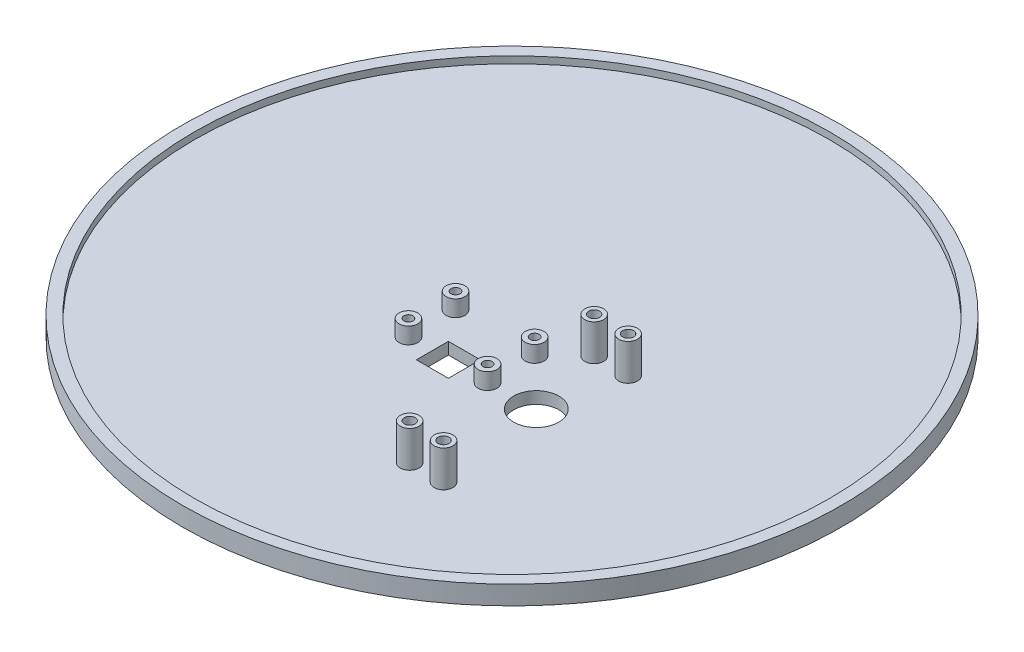
ISO-10303-21;
HEADER;
FILE_DESCRIPTION(('STEP AP214'),'2;1');
FILE_NAME('part.step','',(''),(''),'','','');
FILE_SCHEMA(('AUTOMOTIVE_DESIGN { 1 0 10303 214 1 1 1 1 }'));
ENDSEC;
DATA;
#1=APPLICATION_CONTEXT('core data for automotive mechanical design processes');
#2=APPLICATION_PROTOCOL_DEFINITION('international standard','automotive_design',2000,#1);
#3=PRODUCT_CONTEXT('',#1,'mechanical');
#4=PRODUCT('Part','Part','',(#3));
#5=PRODUCT_RELATED_PRODUCT_CATEGORY('part','',(#4));
#6=PRODUCT_DEFINITION_FORMATION('','',#4);
#7=PRODUCT_DEFINITION_CONTEXT('part definition',#1,'design');
#8=PRODUCT_DEFINITION('design','',#6,#7);
#9=PRODUCT_DEFINITION_SHAPE('','',#8);
#10=(LENGTH_UNIT() NAMED_UNIT(*) SI_UNIT(.MILLI.,.METRE.));
#11=(NAMED_UNIT(*) PLANE_ANGLE_UNIT() SI_UNIT($,.RADIAN.));
#12=(NAMED_UNIT(*) SI_UNIT($,.STERADIAN.) SOLID_ANGLE_UNIT());
#13=UNCERTAINTY_MEASURE_WITH_UNIT(LENGTH_MEASURE(1.E-05),#10,'distance_accuracy_value','');
#14=(GEOMETRIC_REPRESENTATION_CONTEXT(3) GLOBAL_UNCERTAINTY_ASSIGNED_CONTEXT((#13)) GLOBAL_UNIT_ASSIGNED_CONTEXT((#10,
#11,#12)) REPRESENTATION_CONTEXT('',''));
#15=CARTESIAN_POINT('',(0.,0.,0.));
#16=DIRECTION('',(0.,0.,1.));
#17=DIRECTION('',(1.,0.,0.));
#18=AXIS2_PLACEMENT_3D('',#15,#16,#17);
#19=CARTESIAN_POINT('',(18.5,12.8,-3.3254));
#20=DIRECTION('',(0.,1.,0.));
#21=DIRECTION('',(0.,0.,1.));
#22=AXIS2_PLACEMENT_3D('',#19,#20,#21);
#23=PLANE('',#22);
#24=CARTESIAN_POINT('',(18.5,12.8,-3.3254));
#25=DIRECTION('',(0.,1.,0.));
#26=DIRECTION('',(0.,0.,1.));
#27=AXIS2_PLACEMENT_3D('',#24,#25,#26);
#28=CIRCLE('',#27,2.5);
#29=CARTESIAN_POINT('',(18.5,12.8,-0.825399999999997));
#30=VERTEX_POINT('',#29);
#31=EDGE_CURVE('E212',#30,#30,#28,.T.);
#32=ORIENTED_EDGE('',*,*,#31,.T.);
#33=EDGE_LOOP('',(#32));
#34=FACE_BOUND('',#33,.T.);
#35=CARTESIAN_POINT('',(18.5,12.8,-3.3254));
#36=DIRECTION('',(0.,-1.,0.));
#37=DIRECTION('',(0.,0.,-1.));
#38=AXIS2_PLACEMENT_3D('',#35,#36,#37);
#39=CIRCLE('',#38,1.44999999999999);
#40=CARTESIAN_POINT('',(18.5,12.8,-4.77539999999999));
#41=VERTEX_POINT('',#40);
#42=EDGE_CURVE('E191',#41,#41,#39,.T.);
#43=ORIENTED_EDGE('',*,*,#42,.T.);
#44=EDGE_LOOP('',(#43));
#45=FACE_BOUND('',#44,.T.);
#46=ADVANCED_FACE('F49',(#34,#45),#23,.T.);
#47=CARTESIAN_POINT('',(27.5,12.8,45.6746));
#48=DIRECTION('',(0.,1.,0.));
#49=DIRECTION('',(0.,0.,1.));
#50=AXIS2_PLACEMENT_3D('',#47,#48,#49);
#51=PLANE('',#50);
#52=CARTESIAN_POINT('',(27.5,12.8,45.6746));
#53=DIRECTION('',(0.,1.,0.));
#54=DIRECTION('',(0.,0.,1.));
#55=AXIS2_PLACEMENT_3D('',#52,#53,#54);
#56=CIRCLE('',#55,2.5);
#57=CARTESIAN_POINT('',(27.5,12.8,48.1746));
#58=VERTEX_POINT('',#57);
#59=EDGE_CURVE('E216',#58,#58,#56,.T.);
#60=ORIENTED_EDGE('',*,*,#59,.T.);
#61=EDGE_LOOP('',(#60));
#62=FACE_BOUND('',#61,.T.);
#63=CARTESIAN_POINT('',(27.5,12.8,45.6746));
#64=DIRECTION('',(0.,-1.,0.));
#65=DIRECTION('',(0.,0.,-1.));
#66=AXIS2_PLACEMENT_3D('',#63,#64,#65);
#67=CIRCLE('',#66,1.44999999999999);
#68=CARTESIAN_POINT('',(27.5,12.8,44.2246));
#69=VERTEX_POINT('',#68);
#70=EDGE_CURVE('E200',#69,#69,#67,.T.);
#71=ORIENTED_EDGE('',*,*,#70,.T.);
#72=EDGE_LOOP('',(#71));
#73=FACE_BOUND('',#72,.T.);
#74=ADVANCED_FACE('F286',(#62,#73),#51,.T.);
#75=CARTESIAN_POINT('',(0.,0.,0.));
#76=DIRECTION('',(0.,1.,0.));
#77=DIRECTION('',(0.,0.,1.));
#78=AXIS2_PLACEMENT_3D('',#75,#76,#77);
#79=PLANE('',#78);
#80=CARTESIAN_POINT('',(-10.5,0.,4.4926));
#81=DIRECTION('',(0.,-1.,0.));
#82=DIRECTION('',(0.,0.,-1.));
#83=AXIS2_PLACEMENT_3D('',#80,#81,#82);
#84=CIRCLE('',#83,2.);
#85=CARTESIAN_POINT('',(-10.5,0.,2.4926));
#86=VERTEX_POINT('',#85);
#87=EDGE_CURVE('E372',#86,#86,#84,.T.);
#88=ORIENTED_EDGE('',*,*,#87,.F.);
#89=EDGE_LOOP('',(#88));
#90=FACE_BOUND('',#89,.T.);
#91=CARTESIAN_POINT('',(10.5,0.,4.4926));
#92=DIRECTION('',(0.,-1.,0.));
#93=DIRECTION('',(0.,0.,-1.));
#94=AXIS2_PLACEMENT_3D('',#91,#92,#93);
#95=CIRCLE('',#94,2.);
#96=CARTESIAN_POINT('',(10.5,0.,2.4926));
#97=VERTEX_POINT('',#96);
#98=EDGE_CURVE('E163',#97,#97,#95,.T.);
#99=ORIENTED_EDGE('',*,*,#98,.F.);
#100=EDGE_LOOP('',(#99));
#101=FACE_BOUND('',#100,.T.);
#102=CARTESIAN_POINT('',(10.5,0.,16.9926));
#103=DIRECTION('',(0.,-1.,0.));
#104=DIRECTION('',(0.,0.,-1.));
#105=AXIS2_PLACEMENT_3D('',#102,#103,#104);
#106=CIRCLE('',#105,2.);
#107=CARTESIAN_POINT('',(10.5,0.,14.9926));
#108=VERTEX_POINT('',#107);
#109=EDGE_CURVE('E156',#108,#108,#106,.T.);
#110=ORIENTED_EDGE('',*,*,#109,.F.);
#111=EDGE_LOOP('',(#110));
#112=FACE_BOUND('',#111,.T.);
#113=CARTESIAN_POINT('',(-10.5,0.,16.9926));
#114=DIRECTION('',(0.,-1.,0.));
#115=DIRECTION('',(0.,0.,-1.));
#116=AXIS2_PLACEMENT_3D('',#113,#114,#115);
#117=CIRCLE('',#116,2.);
#118=CARTESIAN_POINT('',(-10.5,0.,14.9926));
#119=VERTEX_POINT('',#118);
#120=EDGE_CURVE('E152',#119,#119,#117,.T.);
#121=ORIENTED_EDGE('',*,*,#120,.F.);
#122=EDGE_LOOP('',(#121));
#123=FACE_BOUND('',#122,.T.);
#124=CARTESIAN_POINT('',(27.5,0.,-3.3254));
#125=DIRECTION('',(0.,-1.,0.));
#126=DIRECTION('',(0.,0.,-1.));
#127=AXIS2_PLACEMENT_3D('',#124,#125,#126);
#128=CIRCLE('',#127,2.5);
#129=CARTESIAN_POINT('',(27.5,0.,-5.82539999999999));
#130=VERTEX_POINT('',#129);
#131=EDGE_CURVE('E148',#130,#130,#128,.T.);
#132=ORIENTED_EDGE('',*,*,#131,.F.);
#133=EDGE_LOOP('',(#132));
#134=FACE_BOUND('',#133,.T.);
#135=CARTESIAN_POINT('',(18.5,0.,-3.3254));
#136=DIRECTION('',(0.,-1.,0.));
#137=DIRECTION('',(0.,0.,-1.));
#138=AXIS2_PLACEMENT_3D('',#135,#136,#137);
#139=CIRCLE('',#138,2.5);
#140=CARTESIAN_POINT('',(18.5,0.,-5.82539999999999));
#141=VERTEX_POINT('',#140);
#142=EDGE_CURVE('E185',#141,#141,#139,.T.);
#143=ORIENTED_EDGE('',*,*,#142,.F.);
#144=EDGE_LOOP('',(#143));
#145=FACE_BOUND('',#144,.T.);
#146=CARTESIAN_POINT('',(27.5,0.,45.6746));
#147=DIRECTION('',(0.,-1.,0.));
#148=DIRECTION('',(0.,0.,-1.));
#149=AXIS2_PLACEMENT_3D('',#146,#147,#148);
#150=CIRCLE('',#149,2.5);
#151=CARTESIAN_POINT('',(27.5,0.,43.1746));
#152=VERTEX_POINT('',#151);
#153=EDGE_CURVE('E194',#152,#152,#150,.T.);
#154=ORIENTED_EDGE('',*,*,#153,.F.);
#155=EDGE_LOOP('',(#154));
#156=FACE_BOUND('',#155,.T.);
#157=CARTESIAN_POINT('',(18.5,0.,45.6746));
#158=DIRECTION('',(0.,-1.,0.));
#159=DIRECTION('',(0.,0.,-1.));
#160=AXIS2_PLACEMENT_3D('',#157,#158,#159);
#161=CIRCLE('',#160,2.5);
#162=CARTESIAN_POINT('',(18.5,0.,43.1746));
#163=VERTEX_POINT('',#162);
#164=EDGE_CURVE('E203',#163,#163,#161,.T.);
#165=ORIENTED_EDGE('',*,*,#164,.F.);
#166=EDGE_LOOP('',(#165));
#167=FACE_BOUND('',#166,.T.);
#168=CARTESIAN_POINT('',(0.,0.,0.));
#169=DIRECTION('',(0.,1.,0.));
#170=DIRECTION('',(0.,0.,1.));
#171=AXIS2_PLACEMENT_3D('',#168,#169,#170);
#172=CIRCLE('',#171,87.5);
#173=CARTESIAN_POINT('',(0.,0.,87.5));
#174=VERTEX_POINT('',#173);
#175=EDGE_CURVE('E58',#174,#174,#172,.T.);
#176=ORIENTED_EDGE('',*,*,#175,.F.);
#177=EDGE_LOOP('',(#176));
#178=FACE_BOUND('',#177,.T.);
#179=CARTESIAN_POINT('',(23.,0.,16.5546));
#180=DIRECTION('',(0.,1.,0.));
#181=DIRECTION('',(0.,0.,1.));
#182=AXIS2_PLACEMENT_3D('',#179,#180,#181);
#183=CIRCLE('',#182,6.);
#184=CARTESIAN_POINT('',(23.,0.,22.5546));
#185=VERTEX_POINT('',#184);
#186=EDGE_CURVE('E134',#185,#185,#183,.T.);
#187=ORIENTED_EDGE('',*,*,#186,.T.);
#188=EDGE_LOOP('',(#187));
#189=FACE_BOUND('',#188,.T.);
#190=DIRECTION('',(0.,0.,-1.));
#191=VECTOR('',#190,1.);
#192=CARTESIAN_POINT('',(-4.25,0.,0.));
#193=LINE('',#192,#191);
#194=CARTESIAN_POINT('',(-4.25,0.,21.1426));
#195=VERTEX_POINT('',#194);
#196=CARTESIAN_POINT('',(-4.25,0.,12.6426));
#197=VERTEX_POINT('',#196);
#198=EDGE_CURVE('E100',#195,#197,#193,.T.);
#199=ORIENTED_EDGE('',*,*,#198,.F.);
#200=DIRECTION('',(-1.,0.,0.));
#201=VECTOR('',#200,1.);
#202=CARTESIAN_POINT('',(0.,0.,21.1426));
#203=LINE('',#202,#201);
#204=CARTESIAN_POINT('',(4.25,0.,21.1426));
#205=VERTEX_POINT('',#204);
#206=EDGE_CURVE('E92',#205,#195,#203,.T.);
#207=ORIENTED_EDGE('',*,*,#206,.F.);
#208=DIRECTION('',(0.,0.,-1.));
#209=VECTOR('',#208,1.);
#210=CARTESIAN_POINT('',(4.25,0.,0.));
#211=LINE('',#210,#209);
#212=CARTESIAN_POINT('',(4.25,0.,12.6426));
#213=VERTEX_POINT('',#212);
#214=EDGE_CURVE('E66',#205,#213,#211,.T.);
#215=ORIENTED_EDGE('',*,*,#214,.T.);
#216=DIRECTION('',(-1.,0.,0.));
#217=VECTOR('',#216,1.);
#218=CARTESIAN_POINT('',(0.,0.,12.6426));
#219=LINE('',#218,#217);
#220=EDGE_CURVE('E104',#213,#197,#219,.T.);
#221=ORIENTED_EDGE('',*,*,#220,.T.);
#222=EDGE_LOOP('',(#199,#207,#215,#221));
#223=FACE_BOUND('',#222,.T.);
#224=ADVANCED_FACE('F107',(#90,#101,#112,#123,#134,#145,#156,#167,#178,#189,#223),#79,.F.);
#225=CARTESIAN_POINT('',(0.,3.175,0.));
#226=DIRECTION('',(0.,1.,0.));
#227=DIRECTION('',(0.,0.,1.));
#228=AXIS2_PLACEMENT_3D('',#225,#226,#227);
#229=PLANE('',#228);
#230=CARTESIAN_POINT('',(18.5,3.175,-3.3254));
#231=DIRECTION('',(0.,1.,0.));
#232=DIRECTION('',(0.,0.,1.));
#233=AXIS2_PLACEMENT_3D('',#230,#231,#232);
#234=CIRCLE('',#233,2.5);
#235=CARTESIAN_POINT('',(18.5,3.175,-0.825399999999997));
#236=VERTEX_POINT('',#235);
#237=EDGE_CURVE('E213',#236,#236,#234,.T.);
#238=ORIENTED_EDGE('',*,*,#237,.F.);
#239=EDGE_LOOP('',(#238));
#240=FACE_BOUND('',#239,.T.);
#241=CARTESIAN_POINT('',(27.5,3.175,45.6746));
#242=DIRECTION('',(0.,1.,0.));
#243=DIRECTION('',(0.,0.,1.));
#244=AXIS2_PLACEMENT_3D('',#241,#242,#243);
#245=CIRCLE('',#244,2.5);
#246=CARTESIAN_POINT('',(27.5,3.175,48.1746));
#247=VERTEX_POINT('',#246);
#248=EDGE_CURVE('E219',#247,#247,#245,.T.);
#249=ORIENTED_EDGE('',*,*,#248,.F.);
#250=EDGE_LOOP('',(#249));
#251=FACE_BOUND('',#250,.T.);
#252=CARTESIAN_POINT('',(18.5,3.175,45.6746));
#253=DIRECTION('',(0.,1.,0.));
#254=DIRECTION('',(0.,0.,1.));
#255=AXIS2_PLACEMENT_3D('',#252,#253,#254);
#256=CIRCLE('',#255,2.5);
#257=CARTESIAN_POINT('',(18.5,3.175,48.1746));
#258=VERTEX_POINT('',#257);
#259=EDGE_CURVE('E225',#258,#258,#256,.T.);
#260=ORIENTED_EDGE('',*,*,#259,.F.);
#261=EDGE_LOOP('',(#260));
#262=FACE_BOUND('',#261,.T.);
#263=CARTESIAN_POINT('',(27.5,3.175,-3.3254));
#264=DIRECTION('',(0.,1.,0.));
#265=DIRECTION('',(0.,0.,1.));
#266=AXIS2_PLACEMENT_3D('',#263,#264,#265);
#267=CIRCLE('',#266,2.49999999999999);
#268=CARTESIAN_POINT('',(27.5,3.175,-0.825400000000001));
#269=VERTEX_POINT('',#268);
#270=EDGE_CURVE('E228',#269,#269,#267,.T.);
#271=ORIENTED_EDGE('',*,*,#270,.F.);
#272=EDGE_LOOP('',(#271));
#273=FACE_BOUND('',#272,.T.);
#274=CARTESIAN_POINT('',(-10.5,3.175,4.4926));
#275=DIRECTION('',(0.,1.,0.));
#276=DIRECTION('',(0.,0.,1.));
#277=AXIS2_PLACEMENT_3D('',#274,#275,#276);
#278=CIRCLE('',#277,2.5);
#279=CARTESIAN_POINT('',(-10.5,3.175,6.9926));
#280=VERTEX_POINT('',#279);
#281=EDGE_CURVE('E237',#280,#280,#278,.T.);
#282=ORIENTED_EDGE('',*,*,#281,.F.);
#283=EDGE_LOOP('',(#282));
#284=FACE_BOUND('',#283,.T.);
#285=CARTESIAN_POINT('',(-10.5,3.175,16.9926));
#286=DIRECTION('',(0.,1.,0.));
#287=DIRECTION('',(0.,0.,1.));
#288=AXIS2_PLACEMENT_3D('',#285,#286,#287);
#289=CIRCLE('',#288,2.5);
#290=CARTESIAN_POINT('',(-10.5,3.175,19.4926));
#291=VERTEX_POINT('',#290);
#292=EDGE_CURVE('E243',#291,#291,#289,.T.);
#293=ORIENTED_EDGE('',*,*,#292,.F.);
#294=EDGE_LOOP('',(#293));
#295=FACE_BOUND('',#294,.T.);
#296=CARTESIAN_POINT('',(10.5,3.175,16.9926));
#297=DIRECTION('',(0.,1.,0.));
#298=DIRECTION('',(0.,0.,1.));
#299=AXIS2_PLACEMENT_3D('',#296,#297,#298);
#300=CIRCLE('',#299,2.5);
#301=CARTESIAN_POINT('',(10.5,3.175,19.4926));
#302=VERTEX_POINT('',#301);
#303=EDGE_CURVE('E249',#302,#302,#300,.T.);
#304=ORIENTED_EDGE('',*,*,#303,.F.);
#305=EDGE_LOOP('',(#304));
#306=FACE_BOUND('',#305,.T.);
#307=CARTESIAN_POINT('',(10.5,3.175,4.4926));
#308=DIRECTION('',(0.,1.,0.));
#309=DIRECTION('',(0.,0.,1.));
#310=AXIS2_PLACEMENT_3D('',#307,#308,#309);
#311=CIRCLE('',#310,2.5);
#312=CARTESIAN_POINT('',(10.5,3.175,6.9926));
#313=VERTEX_POINT('',#312);
#314=EDGE_CURVE('E115',#313,#313,#311,.T.);
#315=ORIENTED_EDGE('',*,*,#314,.F.);
#316=EDGE_LOOP('',(#315));
#317=FACE_BOUND('',#316,.T.);
#318=CARTESIAN_POINT('',(23.,3.175,16.5546));
#319=DIRECTION('',(0.,1.,0.));
#320=DIRECTION('',(0.,0.,1.));
#321=AXIS2_PLACEMENT_3D('',#318,#319,#320);
#322=CIRCLE('',#321,6.);
#323=CARTESIAN_POINT('',(23.,3.175,22.5546));
#324=VERTEX_POINT('',#323);
#325=EDGE_CURVE('E122',#324,#324,#322,.T.);
#326=ORIENTED_EDGE('',*,*,#325,.F.);
#327=EDGE_LOOP('',(#326));
#328=FACE_BOUND('',#327,.T.);
#329=CARTESIAN_POINT('',(0.,3.175,0.));
#330=DIRECTION('',(0.,1.,0.));
#331=DIRECTION('',(0.,0.,1.));
#332=AXIS2_PLACEMENT_3D('',#329,#330,#331);
#333=CIRCLE('',#332,84.325);
#334=CARTESIAN_POINT('',(0.,3.175,84.325));
#335=VERTEX_POINT('',#334);
#336=EDGE_CURVE('E138',#335,#335,#333,.T.);
#337=ORIENTED_EDGE('',*,*,#336,.T.);
#338=EDGE_LOOP('',(#337));
#339=FACE_BOUND('',#338,.T.);
#340=DIRECTION('',(-1.,0.,0.));
#341=VECTOR('',#340,1.);
#342=CARTESIAN_POINT('',(0.,3.175,21.1426));
#343=LINE('',#342,#341);
#344=CARTESIAN_POINT('',(4.25,3.175,21.1426));
#345=VERTEX_POINT('',#344);
#346=CARTESIAN_POINT('',(-4.25,3.175,21.1426));
#347=VERTEX_POINT('',#346);
#348=EDGE_CURVE('E121',#345,#347,#343,.T.);
#349=ORIENTED_EDGE('',*,*,#348,.T.);
#350=DIRECTION('',(0.,0.,-1.));
#351=VECTOR('',#350,1.);
#352=CARTESIAN_POINT('',(-4.25,3.175,0.));
#353=LINE('',#352,#351);
#354=CARTESIAN_POINT('',(-4.25,3.175,12.6426));
#355=VERTEX_POINT('',#354);
#356=EDGE_CURVE('E74',#347,#355,#353,.T.);
#357=ORIENTED_EDGE('',*,*,#356,.T.);
#358=DIRECTION('',(-1.,0.,0.));
#359=VECTOR('',#358,1.);
#360=CARTESIAN_POINT('',(0.,3.175,12.6426));
#361=LINE('',#360,#359);
#362=CARTESIAN_POINT('',(4.25,3.175,12.6426));
#363=VERTEX_POINT('',#362);
#364=EDGE_CURVE('E109',#363,#355,#361,.T.);
#365=ORIENTED_EDGE('',*,*,#364,.F.);
#366=DIRECTION('',(0.,0.,-1.));
#367=VECTOR('',#366,1.);
#368=CARTESIAN_POINT('',(4.25,3.175,0.));
#369=LINE('',#368,#367);
#370=EDGE_CURVE('E112',#345,#363,#369,.T.);
#371=ORIENTED_EDGE('',*,*,#370,.F.);
#372=EDGE_LOOP('',(#349,#357,#365,#371));
#373=FACE_BOUND('',#372,.T.);
#374=ADVANCED_FACE('F261',(#240,#251,#262,#273,#284,#295,#306,#317,#328,#339,#373),#229,.T.);
#375=CARTESIAN_POINT('',(0.,5.,0.));
#376=DIRECTION('',(0.,-1.,0.));
#377=DIRECTION('',(0.,0.,-1.));
#378=AXIS2_PLACEMENT_3D('',#375,#376,#377);
#379=CYLINDRICAL_SURFACE('',#378,87.5);
#380=CARTESIAN_POINT('',(0.,5.,0.));
#381=DIRECTION('',(0.,1.,0.));
#382=DIRECTION('',(0.,0.,1.));
#383=AXIS2_PLACEMENT_3D('',#380,#381,#382);
#384=CIRCLE('',#383,87.5);
#385=CARTESIAN_POINT('',(0.,5.,87.5));
#386=VERTEX_POINT('',#385);
#387=EDGE_CURVE('E12',#386,#386,#384,.T.);
#388=ORIENTED_EDGE('',*,*,#387,.F.);
#389=EDGE_LOOP('',(#388));
#390=FACE_BOUND('',#389,.T.);
#391=ORIENTED_EDGE('',*,*,#175,.T.);
#392=EDGE_LOOP('',(#391));
#393=FACE_BOUND('',#392,.T.);
#394=ADVANCED_FACE('F51',(#390,#393),#379,.T.);
#395=CARTESIAN_POINT('',(0.,5.,0.));
#396=DIRECTION('',(0.,1.,0.));
#397=DIRECTION('',(0.,0.,1.));
#398=AXIS2_PLACEMENT_3D('',#395,#396,#397);
#399=PLANE('',#398);
#400=CARTESIAN_POINT('',(0.,5.,0.));
#401=DIRECTION('',(0.,1.,0.));
#402=DIRECTION('',(0.,0.,1.));
#403=AXIS2_PLACEMENT_3D('',#400,#401,#402);
#404=CIRCLE('',#403,84.325);
#405=CARTESIAN_POINT('',(0.,5.,84.325));
#406=VERTEX_POINT('',#405);
#407=EDGE_CURVE('E128',#406,#406,#404,.T.);
#408=ORIENTED_EDGE('',*,*,#407,.F.);
#409=EDGE_LOOP('',(#408));
#410=FACE_BOUND('',#409,.T.);
#411=ORIENTED_EDGE('',*,*,#387,.T.);
#412=EDGE_LOOP('',(#411));
#413=FACE_BOUND('',#412,.T.);
#414=ADVANCED_FACE('F361',(#410,#413),#399,.T.);
#415=CARTESIAN_POINT('',(0.,3.175,0.));
#416=DIRECTION('',(0.,1.,0.));
#417=DIRECTION('',(0.,0.,1.));
#418=AXIS2_PLACEMENT_3D('',#415,#416,#417);
#419=CYLINDRICAL_SURFACE('',#418,84.325);
#420=ORIENTED_EDGE('',*,*,#336,.F.);
#421=EDGE_LOOP('',(#420));
#422=FACE_BOUND('',#421,.T.);
#423=ORIENTED_EDGE('',*,*,#407,.T.);
#424=EDGE_LOOP('',(#423));
#425=FACE_BOUND('',#424,.T.);
#426=ADVANCED_FACE('F356',(#422,#425),#419,.F.);
#427=CARTESIAN_POINT('',(23.,0.,16.5546));
#428=DIRECTION('',(0.,1.,0.));
#429=DIRECTION('',(0.,0.,1.));
#430=AXIS2_PLACEMENT_3D('',#427,#428,#429);
#431=CYLINDRICAL_SURFACE('',#430,6.);
#432=ORIENTED_EDGE('',*,*,#186,.F.);
#433=EDGE_LOOP('',(#432));
#434=FACE_BOUND('',#433,.T.);
#435=ORIENTED_EDGE('',*,*,#325,.T.);
#436=EDGE_LOOP('',(#435));
#437=FACE_BOUND('',#436,.T.);
#438=ADVANCED_FACE('F282',(#434,#437),#431,.F.);
#439=CARTESIAN_POINT('',(-4.25,0.,0.));
#440=DIRECTION('',(1.,0.,0.));
#441=DIRECTION('',(0.,0.,-1.));
#442=AXIS2_PLACEMENT_3D('',#439,#440,#441);
#443=PLANE('',#442);
#444=ORIENTED_EDGE('',*,*,#356,.F.);
#445=DIRECTION('',(0.,1.,0.));
#446=VECTOR('',#445,1.);
#447=CARTESIAN_POINT('',(-4.25,0.,21.1426));
#448=LINE('',#447,#446);
#449=EDGE_CURVE('E95',#195,#347,#448,.T.);
#450=ORIENTED_EDGE('',*,*,#449,.F.);
#451=ORIENTED_EDGE('',*,*,#198,.T.);
#452=DIRECTION('',(0.,1.,0.));
#453=VECTOR('',#452,1.);
#454=CARTESIAN_POINT('',(-4.25,0.,12.6426));
#455=LINE('',#454,#453);
#456=EDGE_CURVE('E126',#197,#355,#455,.T.);
#457=ORIENTED_EDGE('',*,*,#456,.T.);
#458=EDGE_LOOP('',(#444,#450,#451,#457));
#459=FACE_BOUND('',#458,.T.);
#460=ADVANCED_FACE('F102',(#459),#443,.T.);
#461=CARTESIAN_POINT('',(0.,0.,12.6426));
#462=DIRECTION('',(0.,0.,-1.));
#463=DIRECTION('',(-1.,0.,0.));
#464=AXIS2_PLACEMENT_3D('',#461,#462,#463);
#465=PLANE('',#464);
#466=ORIENTED_EDGE('',*,*,#364,.T.);
#467=ORIENTED_EDGE('',*,*,#456,.F.);
#468=ORIENTED_EDGE('',*,*,#220,.F.);
#469=DIRECTION('',(0.,1.,0.));
#470=VECTOR('',#469,1.);
#471=CARTESIAN_POINT('',(4.25,0.,12.6426));
#472=LINE('',#471,#470);
#473=EDGE_CURVE('E129',#213,#363,#472,.T.);
#474=ORIENTED_EDGE('',*,*,#473,.T.);
#475=EDGE_LOOP('',(#466,#467,#468,#474));
#476=FACE_BOUND('',#475,.T.);
#477=ADVANCED_FACE('F274',(#476),#465,.F.);
#478=CARTESIAN_POINT('',(4.25,0.,0.));
#479=DIRECTION('',(1.,0.,0.));
#480=DIRECTION('',(0.,0.,-1.));
#481=AXIS2_PLACEMENT_3D('',#478,#479,#480);
#482=PLANE('',#481);
#483=ORIENTED_EDGE('',*,*,#370,.T.);
#484=ORIENTED_EDGE('',*,*,#473,.F.);
#485=ORIENTED_EDGE('',*,*,#214,.F.);
#486=DIRECTION('',(0.,1.,0.));
#487=VECTOR('',#486,1.);
#488=CARTESIAN_POINT('',(4.25,0.,21.1426));
#489=LINE('',#488,#487);
#490=EDGE_CURVE('E97',#205,#345,#489,.T.);
#491=ORIENTED_EDGE('',*,*,#490,.T.);
#492=EDGE_LOOP('',(#483,#484,#485,#491));
#493=FACE_BOUND('',#492,.T.);
#494=ADVANCED_FACE('F272',(#493),#482,.F.);
#495=CARTESIAN_POINT('',(0.,0.,21.1426));
#496=DIRECTION('',(0.,0.,-1.));
#497=DIRECTION('',(-1.,0.,0.));
#498=AXIS2_PLACEMENT_3D('',#495,#496,#497);
#499=PLANE('',#498);
#500=ORIENTED_EDGE('',*,*,#348,.F.);
#501=ORIENTED_EDGE('',*,*,#490,.F.);
#502=ORIENTED_EDGE('',*,*,#206,.T.);
#503=ORIENTED_EDGE('',*,*,#449,.T.);
#504=EDGE_LOOP('',(#500,#501,#502,#503));
#505=FACE_BOUND('',#504,.T.);
#506=ADVANCED_FACE('F94',(#505),#499,.T.);
#507=CARTESIAN_POINT('',(10.5,7.5,4.4926));
#508=DIRECTION('',(0.,-1.,0.));
#509=DIRECTION('',(0.,0.,-1.));
#510=AXIS2_PLACEMENT_3D('',#507,#508,#509);
#511=CYLINDRICAL_SURFACE('',#510,2.5);
#512=CARTESIAN_POINT('',(10.5,7.5,4.4926));
#513=DIRECTION('',(0.,1.,0.));
#514=DIRECTION('',(0.,0.,1.));
#515=AXIS2_PLACEMENT_3D('',#512,#513,#514);
#516=CIRCLE('',#515,2.5);
#517=CARTESIAN_POINT('',(10.5,7.5,6.9926));
#518=VERTEX_POINT('',#517);
#519=EDGE_CURVE('E137',#518,#518,#516,.T.);
#520=ORIENTED_EDGE('',*,*,#519,.F.);
#521=EDGE_LOOP('',(#520));
#522=FACE_BOUND('',#521,.T.);
#523=ORIENTED_EDGE('',*,*,#314,.T.);
#524=EDGE_LOOP('',(#523));
#525=FACE_BOUND('',#524,.T.);
#526=ADVANCED_FACE('F259',(#522,#525),#511,.T.);
#527=CARTESIAN_POINT('',(0.,7.5,0.));
#528=DIRECTION('',(0.,1.,0.));
#529=DIRECTION('',(0.,0.,1.));
#530=AXIS2_PLACEMENT_3D('',#527,#528,#529);
#531=PLANE('',#530);
#532=CARTESIAN_POINT('',(10.5,7.5,4.4926));
#533=DIRECTION('',(0.,1.,0.));
#534=DIRECTION('',(0.,0.,1.));
#535=AXIS2_PLACEMENT_3D('',#532,#533,#534);
#536=CIRCLE('',#535,1.19999999999999);
#537=CARTESIAN_POINT('',(10.5,7.5,5.69259999999999));
#538=VERTEX_POINT('',#537);
#539=EDGE_CURVE('E154',#538,#538,#536,.T.);
#540=ORIENTED_EDGE('',*,*,#539,.F.);
#541=EDGE_LOOP('',(#540));
#542=FACE_BOUND('',#541,.T.);
#543=ORIENTED_EDGE('',*,*,#519,.T.);
#544=EDGE_LOOP('',(#543));
#545=FACE_BOUND('',#544,.T.);
#546=ADVANCED_FACE('F339',(#542,#545),#531,.T.);
#547=CARTESIAN_POINT('',(10.5,7.5,16.9926));
#548=DIRECTION('',(0.,-1.,0.));
#549=DIRECTION('',(0.,0.,-1.));
#550=AXIS2_PLACEMENT_3D('',#547,#548,#549);
#551=CYLINDRICAL_SURFACE('',#550,2.5);
#552=CARTESIAN_POINT('',(10.5,7.5,16.9926));
#553=DIRECTION('',(0.,1.,0.));
#554=DIRECTION('',(0.,0.,1.));
#555=AXIS2_PLACEMENT_3D('',#552,#553,#554);
#556=CIRCLE('',#555,2.5);
#557=CARTESIAN_POINT('',(10.5,7.5,19.4926));
#558=VERTEX_POINT('',#557);
#559=EDGE_CURVE('E246',#558,#558,#556,.T.);
#560=ORIENTED_EDGE('',*,*,#559,.F.);
#561=EDGE_LOOP('',(#560));
#562=FACE_BOUND('',#561,.T.);
#563=ORIENTED_EDGE('',*,*,#303,.T.);
#564=EDGE_LOOP('',(#563));
#565=FACE_BOUND('',#564,.T.);
#566=ADVANCED_FACE('F336',(#562,#565),#551,.T.);
#567=CARTESIAN_POINT('',(0.,7.5,0.));
#568=DIRECTION('',(0.,1.,0.));
#569=DIRECTION('',(0.,0.,1.));
#570=AXIS2_PLACEMENT_3D('',#567,#568,#569);
#571=PLANE('',#570);
#572=CARTESIAN_POINT('',(10.5,7.5,16.9926));
#573=DIRECTION('',(0.,1.,0.));
#574=DIRECTION('',(0.,0.,1.));
#575=AXIS2_PLACEMENT_3D('',#572,#573,#574);
#576=CIRCLE('',#575,1.19999999999999);
#577=CARTESIAN_POINT('',(10.5,7.5,18.1926));
#578=VERTEX_POINT('',#577);
#579=EDGE_CURVE('E150',#578,#578,#576,.T.);
#580=ORIENTED_EDGE('',*,*,#579,.F.);
#581=EDGE_LOOP('',(#580));
#582=FACE_BOUND('',#581,.T.);
#583=ORIENTED_EDGE('',*,*,#559,.T.);
#584=EDGE_LOOP('',(#583));
#585=FACE_BOUND('',#584,.T.);
#586=ADVANCED_FACE('F331',(#582,#585),#571,.T.);
#587=CARTESIAN_POINT('',(-10.5,7.5,16.9926));
#588=DIRECTION('',(0.,-1.,0.));
#589=DIRECTION('',(0.,0.,-1.));
#590=AXIS2_PLACEMENT_3D('',#587,#588,#589);
#591=CYLINDRICAL_SURFACE('',#590,2.5);
#592=CARTESIAN_POINT('',(-10.5,7.5,16.9926));
#593=DIRECTION('',(0.,1.,0.));
#594=DIRECTION('',(0.,0.,1.));
#595=AXIS2_PLACEMENT_3D('',#592,#593,#594);
#596=CIRCLE('',#595,2.5);
#597=CARTESIAN_POINT('',(-10.5,7.5,19.4926));
#598=VERTEX_POINT('',#597);
#599=EDGE_CURVE('E240',#598,#598,#596,.T.);
#600=ORIENTED_EDGE('',*,*,#599,.F.);
#601=EDGE_LOOP('',(#600));
#602=FACE_BOUND('',#601,.T.);
#603=ORIENTED_EDGE('',*,*,#292,.T.);
#604=EDGE_LOOP('',(#603));
#605=FACE_BOUND('',#604,.T.);
#606=ADVANCED_FACE('F328',(#602,#605),#591,.T.);
#607=CARTESIAN_POINT('',(0.,7.5,0.));
#608=DIRECTION('',(0.,1.,0.));
#609=DIRECTION('',(0.,0.,1.));
#610=AXIS2_PLACEMENT_3D('',#607,#608,#609);
#611=PLANE('',#610);
#612=CARTESIAN_POINT('',(-10.5,7.5,16.9926));
#613=DIRECTION('',(0.,1.,0.));
#614=DIRECTION('',(0.,0.,1.));
#615=AXIS2_PLACEMENT_3D('',#612,#613,#614);
#616=CIRCLE('',#615,1.19999999999999);
#617=CARTESIAN_POINT('',(-10.5,7.5,18.1926));
#618=VERTEX_POINT('',#617);
#619=EDGE_CURVE('E145',#618,#618,#616,.T.);
#620=ORIENTED_EDGE('',*,*,#619,.F.);
#621=EDGE_LOOP('',(#620));
#622=FACE_BOUND('',#621,.T.);
#623=ORIENTED_EDGE('',*,*,#599,.T.);
#624=EDGE_LOOP('',(#623));
#625=FACE_BOUND('',#624,.T.);
#626=ADVANCED_FACE('F323',(#622,#625),#611,.T.);
#627=CARTESIAN_POINT('',(-10.5,7.5,4.4926));
#628=DIRECTION('',(0.,-1.,0.));
#629=DIRECTION('',(0.,0.,-1.));
#630=AXIS2_PLACEMENT_3D('',#627,#628,#629);
#631=CYLINDRICAL_SURFACE('',#630,2.5);
#632=CARTESIAN_POINT('',(-10.5,7.5,4.4926));
#633=DIRECTION('',(0.,1.,0.));
#634=DIRECTION('',(0.,0.,1.));
#635=AXIS2_PLACEMENT_3D('',#632,#633,#634);
#636=CIRCLE('',#635,2.5);
#637=CARTESIAN_POINT('',(-10.5,7.5,6.9926));
#638=VERTEX_POINT('',#637);
#639=EDGE_CURVE('E234',#638,#638,#636,.T.);
#640=ORIENTED_EDGE('',*,*,#639,.F.);
#641=EDGE_LOOP('',(#640));
#642=FACE_BOUND('',#641,.T.);
#643=ORIENTED_EDGE('',*,*,#281,.T.);
#644=EDGE_LOOP('',(#643));
#645=FACE_BOUND('',#644,.T.);
#646=ADVANCED_FACE('F320',(#642,#645),#631,.T.);
#647=CARTESIAN_POINT('',(-10.5,7.5,4.4926));
#648=DIRECTION('',(0.,1.,0.));
#649=DIRECTION('',(0.,0.,1.));
#650=AXIS2_PLACEMENT_3D('',#647,#648,#649);
#651=PLANE('',#650);
#652=CARTESIAN_POINT('',(-10.5,7.5,4.4926));
#653=DIRECTION('',(0.,1.,0.));
#654=DIRECTION('',(0.,0.,1.));
#655=AXIS2_PLACEMENT_3D('',#652,#653,#654);
#656=CIRCLE('',#655,1.19999999999999);
#657=CARTESIAN_POINT('',(-10.5,7.5,5.69259999999999));
#658=VERTEX_POINT('',#657);
#659=EDGE_CURVE('E53',#658,#658,#656,.T.);
#660=ORIENTED_EDGE('',*,*,#659,.F.);
#661=EDGE_LOOP('',(#660));
#662=FACE_BOUND('',#661,.T.);
#663=ORIENTED_EDGE('',*,*,#639,.T.);
#664=EDGE_LOOP('',(#663));
#665=FACE_BOUND('',#664,.T.);
#666=ADVANCED_FACE('F318',(#662,#665),#651,.T.);
#667=CARTESIAN_POINT('',(27.5,12.8,-3.3254));
#668=DIRECTION('',(0.,-1.,0.));
#669=DIRECTION('',(0.,0.,-1.));
#670=AXIS2_PLACEMENT_3D('',#667,#668,#669);
#671=CYLINDRICAL_SURFACE('',#670,2.49999999999999);
#672=CARTESIAN_POINT('',(27.5,12.8,-3.3254));
#673=DIRECTION('',(0.,1.,0.));
#674=DIRECTION('',(0.,0.,1.));
#675=AXIS2_PLACEMENT_3D('',#672,#673,#674);
#676=CIRCLE('',#675,2.49999999999999);
#677=CARTESIAN_POINT('',(27.5,12.8,-0.825400000000001));
#678=VERTEX_POINT('',#677);
#679=EDGE_CURVE('E231',#678,#678,#676,.T.);
#680=ORIENTED_EDGE('',*,*,#679,.F.);
#681=EDGE_LOOP('',(#680));
#682=FACE_BOUND('',#681,.T.);
#683=ORIENTED_EDGE('',*,*,#270,.T.);
#684=EDGE_LOOP('',(#683));
#685=FACE_BOUND('',#684,.T.);
#686=ADVANCED_FACE('F314',(#682,#685),#671,.T.);
#687=CARTESIAN_POINT('',(0.,12.8,0.));
#688=DIRECTION('',(0.,1.,0.));
#689=DIRECTION('',(0.,0.,1.));
#690=AXIS2_PLACEMENT_3D('',#687,#688,#689);
#691=PLANE('',#690);
#692=CARTESIAN_POINT('',(27.5,12.8,-3.3254));
#693=DIRECTION('',(0.,-1.,0.));
#694=DIRECTION('',(0.,0.,-1.));
#695=AXIS2_PLACEMENT_3D('',#692,#693,#694);
#696=CIRCLE('',#695,1.44999999999999);
#697=CARTESIAN_POINT('',(27.5,12.8,-4.77539999999999));
#698=VERTEX_POINT('',#697);
#699=EDGE_CURVE('E182',#698,#698,#696,.T.);
#700=ORIENTED_EDGE('',*,*,#699,.T.);
#701=EDGE_LOOP('',(#700));
#702=FACE_BOUND('',#701,.T.);
#703=ORIENTED_EDGE('',*,*,#679,.T.);
#704=EDGE_LOOP('',(#703));
#705=FACE_BOUND('',#704,.T.);
#706=ADVANCED_FACE('F307',(#702,#705),#691,.T.);
#707=CARTESIAN_POINT('',(18.5,12.8,45.6746));
#708=DIRECTION('',(0.,-1.,0.));
#709=DIRECTION('',(0.,0.,-1.));
#710=AXIS2_PLACEMENT_3D('',#707,#708,#709);
#711=CYLINDRICAL_SURFACE('',#710,2.5);
#712=CARTESIAN_POINT('',(18.5,12.8,45.6746));
#713=DIRECTION('',(0.,1.,0.));
#714=DIRECTION('',(0.,0.,1.));
#715=AXIS2_PLACEMENT_3D('',#712,#713,#714);
#716=CIRCLE('',#715,2.5);
#717=CARTESIAN_POINT('',(18.5,12.8,48.1746));
#718=VERTEX_POINT('',#717);
#719=EDGE_CURVE('E222',#718,#718,#716,.T.);
#720=ORIENTED_EDGE('',*,*,#719,.F.);
#721=EDGE_LOOP('',(#720));
#722=FACE_BOUND('',#721,.T.);
#723=ORIENTED_EDGE('',*,*,#259,.T.);
#724=EDGE_LOOP('',(#723));
#725=FACE_BOUND('',#724,.T.);
#726=ADVANCED_FACE('F304',(#722,#725),#711,.T.);
#727=CARTESIAN_POINT('',(0.,12.8,0.));
#728=DIRECTION('',(0.,1.,0.));
#729=DIRECTION('',(0.,0.,1.));
#730=AXIS2_PLACEMENT_3D('',#727,#728,#729);
#731=PLANE('',#730);
#732=CARTESIAN_POINT('',(18.5,12.8,45.6746));
#733=DIRECTION('',(0.,-1.,0.));
#734=DIRECTION('',(0.,0.,-1.));
#735=AXIS2_PLACEMENT_3D('',#732,#733,#734);
#736=CIRCLE('',#735,1.44999999999999);
#737=CARTESIAN_POINT('',(18.5,12.8,44.2246));
#738=VERTEX_POINT('',#737);
#739=EDGE_CURVE('E209',#738,#738,#736,.T.);
#740=ORIENTED_EDGE('',*,*,#739,.T.);
#741=EDGE_LOOP('',(#740));
#742=FACE_BOUND('',#741,.T.);
#743=ORIENTED_EDGE('',*,*,#719,.T.);
#744=EDGE_LOOP('',(#743));
#745=FACE_BOUND('',#744,.T.);
#746=ADVANCED_FACE('F301',(#742,#745),#731,.T.);
#747=CARTESIAN_POINT('',(27.5,12.8,45.6746));
#748=DIRECTION('',(0.,-1.,0.));
#749=DIRECTION('',(0.,0.,-1.));
#750=AXIS2_PLACEMENT_3D('',#747,#748,#749);
#751=CYLINDRICAL_SURFACE('',#750,2.5);
#752=ORIENTED_EDGE('',*,*,#59,.F.);
#753=EDGE_LOOP('',(#752));
#754=FACE_BOUND('',#753,.T.);
#755=ORIENTED_EDGE('',*,*,#248,.T.);
#756=EDGE_LOOP('',(#755));
#757=FACE_BOUND('',#756,.T.);
#758=ADVANCED_FACE('F299',(#754,#757),#751,.T.);
#759=CARTESIAN_POINT('',(18.5,12.8,-3.3254));
#760=DIRECTION('',(0.,-1.,0.));
#761=DIRECTION('',(0.,0.,-1.));
#762=AXIS2_PLACEMENT_3D('',#759,#760,#761);
#763=CYLINDRICAL_SURFACE('',#762,2.5);
#764=ORIENTED_EDGE('',*,*,#31,.F.);
#765=EDGE_LOOP('',(#764));
#766=FACE_BOUND('',#765,.T.);
#767=ORIENTED_EDGE('',*,*,#237,.T.);
#768=EDGE_LOOP('',(#767));
#769=FACE_BOUND('',#768,.T.);
#770=ADVANCED_FACE('F297',(#766,#769),#763,.T.);
#771=CARTESIAN_POINT('',(18.5,0.,45.6746));
#772=DIRECTION('',(0.,-1.,0.));
#773=DIRECTION('',(0.,0.,-1.));
#774=AXIS2_PLACEMENT_3D('',#771,#772,#773);
#775=CYLINDRICAL_SURFACE('',#774,1.44999999999999);
#776=ORIENTED_EDGE('',*,*,#739,.F.);
#777=EDGE_LOOP('',(#776));
#778=FACE_BOUND('',#777,.T.);
#779=CARTESIAN_POINT('',(18.5,1.01397321354742,45.6746));
#780=DIRECTION('',(0.,-1.,0.));
#781=DIRECTION('',(0.,0.,-1.));
#782=AXIS2_PLACEMENT_3D('',#779,#780,#781);
#783=CIRCLE('',#782,1.44999999999999);
#784=CARTESIAN_POINT('',(18.5,1.01397321354742,44.2246));
#785=VERTEX_POINT('',#784);
#786=EDGE_CURVE('E206',#785,#785,#783,.T.);
#787=ORIENTED_EDGE('',*,*,#786,.T.);
#788=EDGE_LOOP('',(#787));
#789=FACE_BOUND('',#788,.T.);
#790=ADVANCED_FACE('F502',(#778,#789),#775,.F.);
#791=CARTESIAN_POINT('',(18.5,0.,45.6746));
#792=DIRECTION('',(0.,-1.,0.));
#793=DIRECTION('',(0.,0.,-1.));
#794=AXIS2_PLACEMENT_3D('',#791,#792,#793);
#795=CONICAL_SURFACE('',#794,2.5,0.802851455917397);
#796=ORIENTED_EDGE('',*,*,#786,.F.);
#797=EDGE_LOOP('',(#796));
#798=FACE_BOUND('',#797,.T.);
#799=ORIENTED_EDGE('',*,*,#164,.T.);
#800=EDGE_LOOP('',(#799));
#801=FACE_BOUND('',#800,.T.);
#802=ADVANCED_FACE('F535',(#798,#801),#795,.F.);
#803=CARTESIAN_POINT('',(27.5,0.,45.6746));
#804=DIRECTION('',(0.,-1.,0.));
#805=DIRECTION('',(0.,0.,-1.));
#806=AXIS2_PLACEMENT_3D('',#803,#804,#805);
#807=CYLINDRICAL_SURFACE('',#806,1.44999999999999);
#808=ORIENTED_EDGE('',*,*,#70,.F.);
#809=EDGE_LOOP('',(#808));
#810=FACE_BOUND('',#809,.T.);
#811=CARTESIAN_POINT('',(27.5,1.01397321354742,45.6746));
#812=DIRECTION('',(0.,-1.,0.));
#813=DIRECTION('',(0.,0.,-1.));
#814=AXIS2_PLACEMENT_3D('',#811,#812,#813);
#815=CIRCLE('',#814,1.44999999999999);
#816=CARTESIAN_POINT('',(27.5,1.01397321354742,44.2246));
#817=VERTEX_POINT('',#816);
#818=EDGE_CURVE('E197',#817,#817,#815,.T.);
#819=ORIENTED_EDGE('',*,*,#818,.T.);
#820=EDGE_LOOP('',(#819));
#821=FACE_BOUND('',#820,.T.);
#822=ADVANCED_FACE('F544',(#810,#821),#807,.F.);
#823=CARTESIAN_POINT('',(27.5,0.,45.6746));
#824=DIRECTION('',(0.,-1.,0.));
#825=DIRECTION('',(0.,0.,-1.));
#826=AXIS2_PLACEMENT_3D('',#823,#824,#825);
#827=CONICAL_SURFACE('',#826,2.5,0.802851455917397);
#828=ORIENTED_EDGE('',*,*,#818,.F.);
#829=EDGE_LOOP('',(#828));
#830=FACE_BOUND('',#829,.T.);
#831=ORIENTED_EDGE('',*,*,#153,.T.);
#832=EDGE_LOOP('',(#831));
#833=FACE_BOUND('',#832,.T.);
#834=ADVANCED_FACE('F555',(#830,#833),#827,.F.);
#835=CARTESIAN_POINT('',(18.5,0.,-3.3254));
#836=DIRECTION('',(0.,-1.,0.));
#837=DIRECTION('',(0.,0.,-1.));
#838=AXIS2_PLACEMENT_3D('',#835,#836,#837);
#839=CYLINDRICAL_SURFACE('',#838,1.44999999999999);
#840=ORIENTED_EDGE('',*,*,#42,.F.);
#841=EDGE_LOOP('',(#840));
#842=FACE_BOUND('',#841,.T.);
#843=CARTESIAN_POINT('',(18.5,1.01397321354742,-3.3254));
#844=DIRECTION('',(0.,-1.,0.));
#845=DIRECTION('',(0.,0.,-1.));
#846=AXIS2_PLACEMENT_3D('',#843,#844,#845);
#847=CIRCLE('',#846,1.44999999999999);
#848=CARTESIAN_POINT('',(18.5,1.01397321354742,-4.77539999999999));
#849=VERTEX_POINT('',#848);
#850=EDGE_CURVE('E188',#849,#849,#847,.T.);
#851=ORIENTED_EDGE('',*,*,#850,.T.);
#852=EDGE_LOOP('',(#851));
#853=FACE_BOUND('',#852,.T.);
#854=ADVANCED_FACE('F566',(#842,#853),#839,.F.);
#855=CARTESIAN_POINT('',(18.5,0.,-3.3254));
#856=DIRECTION('',(0.,-1.,0.));
#857=DIRECTION('',(0.,0.,-1.));
#858=AXIS2_PLACEMENT_3D('',#855,#856,#857);
#859=CONICAL_SURFACE('',#858,2.5,0.802851455917395);
#860=ORIENTED_EDGE('',*,*,#850,.F.);
#861=EDGE_LOOP('',(#860));
#862=FACE_BOUND('',#861,.T.);
#863=ORIENTED_EDGE('',*,*,#142,.T.);
#864=EDGE_LOOP('',(#863));
#865=FACE_BOUND('',#864,.T.);
#866=ADVANCED_FACE('F577',(#862,#865),#859,.F.);
#867=CARTESIAN_POINT('',(27.5,0.,-3.3254));
#868=DIRECTION('',(0.,-1.,0.));
#869=DIRECTION('',(0.,0.,-1.));
#870=AXIS2_PLACEMENT_3D('',#867,#868,#869);
#871=CYLINDRICAL_SURFACE('',#870,1.44999999999999);
#872=ORIENTED_EDGE('',*,*,#699,.F.);
#873=EDGE_LOOP('',(#872));
#874=FACE_BOUND('',#873,.T.);
#875=CARTESIAN_POINT('',(27.5,1.01397321354742,-3.3254));
#876=DIRECTION('',(0.,-1.,0.));
#877=DIRECTION('',(0.,0.,-1.));
#878=AXIS2_PLACEMENT_3D('',#875,#876,#877);
#879=CIRCLE('',#878,1.44999999999999);
#880=CARTESIAN_POINT('',(27.5,1.01397321354742,-4.77539999999999));
#881=VERTEX_POINT('',#880);
#882=EDGE_CURVE('E179',#881,#881,#879,.T.);
#883=ORIENTED_EDGE('',*,*,#882,.T.);
#884=EDGE_LOOP('',(#883));
#885=FACE_BOUND('',#884,.T.);
#886=ADVANCED_FACE('F588',(#874,#885),#871,.F.);
#887=CARTESIAN_POINT('',(27.5,0.,-3.3254));
#888=DIRECTION('',(0.,-1.,0.));
#889=DIRECTION('',(0.,0.,-1.));
#890=AXIS2_PLACEMENT_3D('',#887,#888,#889);
#891=CONICAL_SURFACE('',#890,2.5,0.802851455917395);
#892=ORIENTED_EDGE('',*,*,#882,.F.);
#893=EDGE_LOOP('',(#892));
#894=FACE_BOUND('',#893,.T.);
#895=ORIENTED_EDGE('',*,*,#131,.T.);
#896=EDGE_LOOP('',(#895));
#897=FACE_BOUND('',#896,.T.);
#898=ADVANCED_FACE('F599',(#894,#897),#891,.F.);
#899=CARTESIAN_POINT('',(-10.5,0.,16.9926));
#900=DIRECTION('',(0.,-1.,0.));
#901=DIRECTION('',(0.,0.,-1.));
#902=AXIS2_PLACEMENT_3D('',#899,#900,#901);
#903=CYLINDRICAL_SURFACE('',#902,1.19999999999999);
#904=ORIENTED_EDGE('',*,*,#619,.T.);
#905=EDGE_LOOP('',(#904));
#906=FACE_BOUND('',#905,.T.);
#907=CARTESIAN_POINT('',(-10.5,0.772551019845663,16.9926));
#908=DIRECTION('',(0.,-1.,0.));
#909=DIRECTION('',(0.,0.,-1.));
#910=AXIS2_PLACEMENT_3D('',#907,#908,#909);
#911=CIRCLE('',#910,1.19999999999999);
#912=CARTESIAN_POINT('',(-10.5,0.772551019845663,15.7926));
#913=VERTEX_POINT('',#912);
#914=EDGE_CURVE('E149',#913,#913,#911,.T.);
#915=ORIENTED_EDGE('',*,*,#914,.T.);
#916=EDGE_LOOP('',(#915));
#917=FACE_BOUND('',#916,.T.);
#918=ADVANCED_FACE('F609',(#906,#917),#903,.F.);
#919=CARTESIAN_POINT('',(-10.5,0.,16.9926));
#920=DIRECTION('',(0.,-1.,0.));
#921=DIRECTION('',(0.,0.,-1.));
#922=AXIS2_PLACEMENT_3D('',#919,#920,#921);
#923=CONICAL_SURFACE('',#922,2.,0.802851455917394);
#924=ORIENTED_EDGE('',*,*,#914,.F.);
#925=EDGE_LOOP('',(#924));
#926=FACE_BOUND('',#925,.T.);
#927=ORIENTED_EDGE('',*,*,#120,.T.);
#928=EDGE_LOOP('',(#927));
#929=FACE_BOUND('',#928,.T.);
#930=ADVANCED_FACE('F649',(#926,#929),#923,.F.);
#931=CARTESIAN_POINT('',(10.5,0.,16.9926));
#932=DIRECTION('',(0.,-1.,0.));
#933=DIRECTION('',(0.,0.,-1.));
#934=AXIS2_PLACEMENT_3D('',#931,#932,#933);
#935=CYLINDRICAL_SURFACE('',#934,1.19999999999999);
#936=ORIENTED_EDGE('',*,*,#579,.T.);
#937=EDGE_LOOP('',(#936));
#938=FACE_BOUND('',#937,.T.);
#939=CARTESIAN_POINT('',(10.5,0.772551019845663,16.9926));
#940=DIRECTION('',(0.,-1.,0.));
#941=DIRECTION('',(0.,0.,-1.));
#942=AXIS2_PLACEMENT_3D('',#939,#940,#941);
#943=CIRCLE('',#942,1.19999999999999);
#944=CARTESIAN_POINT('',(10.5,0.772551019845663,15.7926));
#945=VERTEX_POINT('',#944);
#946=EDGE_CURVE('E153',#945,#945,#943,.T.);
#947=ORIENTED_EDGE('',*,*,#946,.T.);
#948=EDGE_LOOP('',(#947));
#949=FACE_BOUND('',#948,.T.);
#950=ADVANCED_FACE('F660',(#938,#949),#935,.F.);
#951=CARTESIAN_POINT('',(10.5,0.,16.9926));
#952=DIRECTION('',(0.,-1.,0.));
#953=DIRECTION('',(0.,0.,-1.));
#954=AXIS2_PLACEMENT_3D('',#951,#952,#953);
#955=CONICAL_SURFACE('',#954,2.,0.802851455917394);
#956=ORIENTED_EDGE('',*,*,#946,.F.);
#957=EDGE_LOOP('',(#956));
#958=FACE_BOUND('',#957,.T.);
#959=ORIENTED_EDGE('',*,*,#109,.T.);
#960=EDGE_LOOP('',(#959));
#961=FACE_BOUND('',#960,.T.);
#962=ADVANCED_FACE('F671',(#958,#961),#955,.F.);
#963=CARTESIAN_POINT('',(10.5,0.,4.4926));
#964=DIRECTION('',(0.,-1.,0.));
#965=DIRECTION('',(0.,0.,-1.));
#966=AXIS2_PLACEMENT_3D('',#963,#964,#965);
#967=CYLINDRICAL_SURFACE('',#966,1.19999999999999);
#968=ORIENTED_EDGE('',*,*,#539,.T.);
#969=EDGE_LOOP('',(#968));
#970=FACE_BOUND('',#969,.T.);
#971=CARTESIAN_POINT('',(10.5,0.772551019845663,4.4926));
#972=DIRECTION('',(0.,-1.,0.));
#973=DIRECTION('',(0.,0.,-1.));
#974=AXIS2_PLACEMENT_3D('',#971,#972,#973);
#975=CIRCLE('',#974,1.19999999999999);
#976=CARTESIAN_POINT('',(10.5,0.772551019845663,3.29260000000001));
#977=VERTEX_POINT('',#976);
#978=EDGE_CURVE('E157',#977,#977,#975,.T.);
#979=ORIENTED_EDGE('',*,*,#978,.T.);
#980=EDGE_LOOP('',(#979));
#981=FACE_BOUND('',#980,.T.);
#982=ADVANCED_FACE('F682',(#970,#981),#967,.F.);
#983=CARTESIAN_POINT('',(10.5,0.,4.4926));
#984=DIRECTION('',(0.,-1.,0.));
#985=DIRECTION('',(0.,0.,-1.));
#986=AXIS2_PLACEMENT_3D('',#983,#984,#985);
#987=CONICAL_SURFACE('',#986,2.,0.802851455917394);
#988=ORIENTED_EDGE('',*,*,#978,.F.);
#989=EDGE_LOOP('',(#988));
#990=FACE_BOUND('',#989,.T.);
#991=ORIENTED_EDGE('',*,*,#98,.T.);
#992=EDGE_LOOP('',(#991));
#993=FACE_BOUND('',#992,.T.);
#994=ADVANCED_FACE('F693',(#990,#993),#987,.F.);
#995=CARTESIAN_POINT('',(-10.5,0.,4.4926));
#996=DIRECTION('',(0.,-1.,0.));
#997=DIRECTION('',(0.,0.,-1.));
#998=AXIS2_PLACEMENT_3D('',#995,#996,#997);
#999=CYLINDRICAL_SURFACE('',#998,1.19999999999999);
#1000=ORIENTED_EDGE('',*,*,#659,.T.);
#1001=EDGE_LOOP('',(#1000));
#1002=FACE_BOUND('',#1001,.T.);
#1003=CARTESIAN_POINT('',(-10.5,0.772551019845663,4.4926));
#1004=DIRECTION('',(0.,-1.,0.));
#1005=DIRECTION('',(0.,0.,-1.));
#1006=AXIS2_PLACEMENT_3D('',#1003,#1004,#1005);
#1007=CIRCLE('',#1006,1.19999999999999);
#1008=CARTESIAN_POINT('',(-10.5,0.772551019845663,3.29260000000001));
#1009=VERTEX_POINT('',#1008);
#1010=EDGE_CURVE('E749',#1009,#1009,#1007,.T.);
#1011=ORIENTED_EDGE('',*,*,#1010,.T.);
#1012=EDGE_LOOP('',(#1011));
#1013=FACE_BOUND('',#1012,.T.);
#1014=ADVANCED_FACE('F703',(#1002,#1013),#999,.F.);
#1015=CARTESIAN_POINT('',(-10.5,0.,4.4926));
#1016=DIRECTION('',(0.,-1.,0.));
#1017=DIRECTION('',(0.,0.,-1.));
#1018=AXIS2_PLACEMENT_3D('',#1015,#1016,#1017);
#1019=CONICAL_SURFACE('',#1018,2.,0.802851455917394);
#1020=ORIENTED_EDGE('',*,*,#1010,.F.);
#1021=EDGE_LOOP('',(#1020));
#1022=FACE_BOUND('',#1021,.T.);
#1023=ORIENTED_EDGE('',*,*,#87,.T.);
#1024=EDGE_LOOP('',(#1023));
#1025=FACE_BOUND('',#1024,.T.);
#1026=ADVANCED_FACE('F714',(#1022,#1025),#1019,.F.);
#1027=CLOSED_SHELL('',(#46,#74,#224,#374,#394,#414,#426,#438,#460,#477,#494,#506,#526,#546,#566,
#586,#606,#626,#646,#666,#686,#706,#726,#746,#758,#770,#790,#802,#822,#834,#854,#866,#886,#898,
#918,#930,#950,#962,#982,#994,#1014,#1026));
#1028=MANIFOLD_SOLID_BREP('B2',#1027);
#1029=ADVANCED_BREP_SHAPE_REPRESENTATION('',(#18,#1028),#14);
#1030=SHAPE_DEFINITION_REPRESENTATION(#9,#1029);
ENDSEC;
END-ISO-10303-21;
